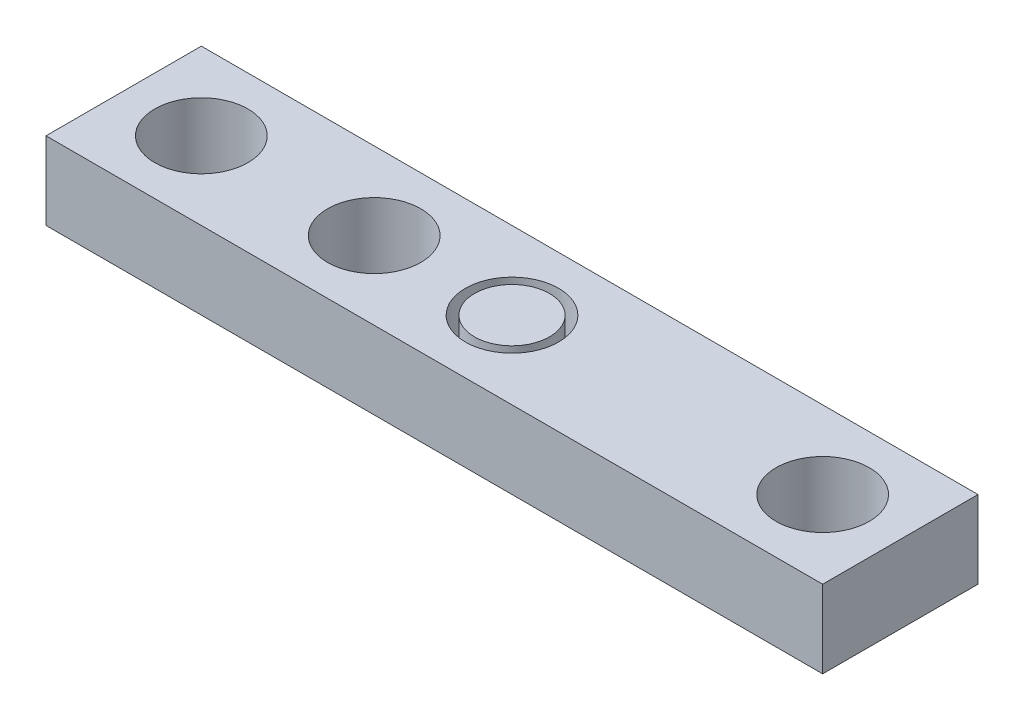
ISO-10303-21;
HEADER;
FILE_DESCRIPTION(('STEP AP214'),'2;1');
FILE_NAME('part.step','',(''),(''),'','','');
FILE_SCHEMA(('AUTOMOTIVE_DESIGN { 1 0 10303 214 1 1 1 1 }'));
ENDSEC;
DATA;
#1=APPLICATION_CONTEXT('core data for automotive mechanical design processes');
#2=APPLICATION_PROTOCOL_DEFINITION('international standard','automotive_design',2000,#1);
#3=PRODUCT_CONTEXT('',#1,'mechanical');
#4=PRODUCT('Part','Part','',(#3));
#5=PRODUCT_RELATED_PRODUCT_CATEGORY('part','',(#4));
#6=PRODUCT_DEFINITION_FORMATION('','',#4);
#7=PRODUCT_DEFINITION_CONTEXT('part definition',#1,'design');
#8=PRODUCT_DEFINITION('design','',#6,#7);
#9=PRODUCT_DEFINITION_SHAPE('','',#8);
#10=(LENGTH_UNIT() NAMED_UNIT(*) SI_UNIT(.MILLI.,.METRE.));
#11=(NAMED_UNIT(*) PLANE_ANGLE_UNIT() SI_UNIT($,.RADIAN.));
#12=(NAMED_UNIT(*) SI_UNIT($,.STERADIAN.) SOLID_ANGLE_UNIT());
#13=UNCERTAINTY_MEASURE_WITH_UNIT(LENGTH_MEASURE(1.E-05),#10,'distance_accuracy_value','');
#14=(GEOMETRIC_REPRESENTATION_CONTEXT(3) GLOBAL_UNCERTAINTY_ASSIGNED_CONTEXT((#13)) GLOBAL_UNIT_ASSIGNED_CONTEXT((#10,
#11,#12)) REPRESENTATION_CONTEXT('',''));
#15=CARTESIAN_POINT('',(0.,0.,0.));
#16=DIRECTION('',(0.,0.,1.));
#17=DIRECTION('',(1.,0.,0.));
#18=AXIS2_PLACEMENT_3D('',#15,#16,#17);
#19=CARTESIAN_POINT('',(0.,-2.5,0.));
#20=DIRECTION('',(0.,1.,0.));
#21=DIRECTION('',(0.,0.,1.));
#22=AXIS2_PLACEMENT_3D('',#19,#20,#21);
#23=CYLINDRICAL_SURFACE('',#22,2.41763312334941);
#24=CARTESIAN_POINT('',(0.,-2.5,0.));
#25=DIRECTION('',(0.,1.,0.));
#26=DIRECTION('',(0.,0.,1.));
#27=AXIS2_PLACEMENT_3D('',#24,#25,#26);
#28=CIRCLE('',#27,2.41763312334941);
#29=CARTESIAN_POINT('',(0.,-2.5,2.41763312334941));
#30=VERTEX_POINT('',#29);
#31=EDGE_CURVE('E11',#30,#30,#28,.T.);
#32=ORIENTED_EDGE('',*,*,#31,.T.);
#33=EDGE_LOOP('',(#32));
#34=FACE_BOUND('',#33,.T.);
#35=CARTESIAN_POINT('',(0.,2.5,0.));
#36=DIRECTION('',(0.,1.,0.));
#37=DIRECTION('',(0.,0.,1.));
#38=AXIS2_PLACEMENT_3D('',#35,#36,#37);
#39=CIRCLE('',#38,2.41763312334941);
#40=CARTESIAN_POINT('',(0.,2.5,2.41763312334941));
#41=VERTEX_POINT('',#40);
#42=EDGE_CURVE('E44',#41,#41,#39,.T.);
#43=ORIENTED_EDGE('',*,*,#42,.F.);
#44=EDGE_LOOP('',(#43));
#45=FACE_BOUND('',#44,.T.);
#46=ADVANCED_FACE('F41',(#34,#45),#23,.T.);
#47=CARTESIAN_POINT('',(0.,-2.5,0.));
#48=DIRECTION('',(0.,1.,0.));
#49=DIRECTION('',(0.,0.,1.));
#50=AXIS2_PLACEMENT_3D('',#47,#48,#49);
#51=PLANE('',#50);
#52=ORIENTED_EDGE('',*,*,#31,.F.);
#53=EDGE_LOOP('',(#52));
#54=FACE_BOUND('',#53,.T.);
#55=ADVANCED_FACE('F56',(#54),#51,.F.);
#56=CARTESIAN_POINT('',(0.,2.5,0.));
#57=DIRECTION('',(0.,1.,0.));
#58=DIRECTION('',(0.,0.,1.));
#59=AXIS2_PLACEMENT_3D('',#56,#57,#58);
#60=PLANE('',#59);
#61=ORIENTED_EDGE('',*,*,#42,.T.);
#62=EDGE_LOOP('',(#61));
#63=FACE_BOUND('',#62,.T.);
#64=ADVANCED_FACE('F53',(#63),#60,.T.);
#65=CLOSED_SHELL('',(#46,#55,#64));
#66=MANIFOLD_SOLID_BREP('B2',#65);
#67=CARTESIAN_POINT('',(0.,2.5,0.));
#68=DIRECTION('',(0.,-1.,0.));
#69=DIRECTION('',(0.,0.,-1.));
#70=AXIS2_PLACEMENT_3D('',#67,#68,#69);
#71=PLANE('',#70);
#72=CARTESIAN_POINT('',(-8.87122983832296,2.5,0.));
#73=DIRECTION('',(0.,1.,0.));
#74=DIRECTION('',(0.,0.,1.));
#75=AXIS2_PLACEMENT_3D('',#72,#73,#74);
#76=CIRCLE('',#75,3.);
#77=CARTESIAN_POINT('',(-8.87122983832296,2.5,3.));
#78=VERTEX_POINT('',#77);
#79=EDGE_CURVE('E178',#78,#78,#76,.T.);
#80=ORIENTED_EDGE('',*,*,#79,.F.);
#81=EDGE_LOOP('',(#80));
#82=FACE_BOUND('',#81,.T.);
#83=CARTESIAN_POINT('',(0.,2.5,0.));
#84=DIRECTION('',(0.,1.,0.));
#85=DIRECTION('',(0.,0.,1.));
#86=AXIS2_PLACEMENT_3D('',#83,#84,#85);
#87=CIRCLE('',#86,3.);
#88=CARTESIAN_POINT('',(0.,2.5,3.));
#89=VERTEX_POINT('',#88);
#90=EDGE_CURVE('E172',#89,#89,#87,.T.);
#91=ORIENTED_EDGE('',*,*,#90,.F.);
#92=EDGE_LOOP('',(#91));
#93=FACE_BOUND('',#92,.T.);
#94=DIRECTION('',(0.,0.,1.));
#95=VECTOR('',#94,1.);
#96=CARTESIAN_POINT('',(-25.,2.5,-5.));
#97=LINE('',#96,#95);
#98=CARTESIAN_POINT('',(-25.,2.5,-5.));
#99=VERTEX_POINT('',#98);
#100=CARTESIAN_POINT('',(-25.,2.5,5.));
#101=VERTEX_POINT('',#100);
#102=EDGE_CURVE('E133',#99,#101,#97,.T.);
#103=ORIENTED_EDGE('',*,*,#102,.T.);
#104=DIRECTION('',(1.,0.,0.));
#105=VECTOR('',#104,1.);
#106=CARTESIAN_POINT('',(25.,2.5,5.));
#107=LINE('',#106,#105);
#108=CARTESIAN_POINT('',(25.,2.5,5.));
#109=VERTEX_POINT('',#108);
#110=EDGE_CURVE('E128',#101,#109,#107,.T.);
#111=ORIENTED_EDGE('',*,*,#110,.T.);
#112=DIRECTION('',(0.,0.,-1.));
#113=VECTOR('',#112,1.);
#114=CARTESIAN_POINT('',(25.,2.5,-5.));
#115=LINE('',#114,#113);
#116=CARTESIAN_POINT('',(25.,2.5,-5.));
#117=VERTEX_POINT('',#116);
#118=EDGE_CURVE('E131',#109,#117,#115,.T.);
#119=ORIENTED_EDGE('',*,*,#118,.T.);
#120=DIRECTION('',(-1.,0.,0.));
#121=VECTOR('',#120,1.);
#122=CARTESIAN_POINT('',(25.,2.5,-5.));
#123=LINE('',#122,#121);
#124=EDGE_CURVE('E98',#117,#99,#123,.T.);
#125=ORIENTED_EDGE('',*,*,#124,.T.);
#126=EDGE_LOOP('',(#103,#111,#119,#125));
#127=FACE_BOUND('',#126,.T.);
#128=CARTESIAN_POINT('',(-20.,2.5,0.));
#129=DIRECTION('',(0.,1.,0.));
#130=DIRECTION('',(0.,0.,1.));
#131=AXIS2_PLACEMENT_3D('',#128,#129,#130);
#132=CIRCLE('',#131,2.99999999999999);
#133=CARTESIAN_POINT('',(-20.,2.5,2.99999999999999));
#134=VERTEX_POINT('',#133);
#135=EDGE_CURVE('E148',#134,#134,#132,.T.);
#136=ORIENTED_EDGE('',*,*,#135,.F.);
#137=EDGE_LOOP('',(#136));
#138=FACE_BOUND('',#137,.T.);
#139=CARTESIAN_POINT('',(20.,2.5,0.));
#140=DIRECTION('',(0.,1.,0.));
#141=DIRECTION('',(0.,0.,1.));
#142=AXIS2_PLACEMENT_3D('',#139,#140,#141);
#143=CIRCLE('',#142,2.99999999999999);
#144=CARTESIAN_POINT('',(20.,2.5,2.99999999999998));
#145=VERTEX_POINT('',#144);
#146=EDGE_CURVE('E163',#145,#145,#143,.T.);
#147=ORIENTED_EDGE('',*,*,#146,.F.);
#148=EDGE_LOOP('',(#147));
#149=FACE_BOUND('',#148,.T.);
#150=ADVANCED_FACE('F81',(#82,#93,#127,#138,#149),#71,.F.);
#151=CARTESIAN_POINT('',(0.,-2.5,0.));
#152=DIRECTION('',(0.,-1.,0.));
#153=DIRECTION('',(0.,0.,-1.));
#154=AXIS2_PLACEMENT_3D('',#151,#152,#153);
#155=PLANE('',#154);
#156=CARTESIAN_POINT('',(-8.87122983832296,-2.5,0.));
#157=DIRECTION('',(0.,1.,0.));
#158=DIRECTION('',(0.,0.,1.));
#159=AXIS2_PLACEMENT_3D('',#156,#157,#158);
#160=CIRCLE('',#159,3.);
#161=CARTESIAN_POINT('',(-8.87122983832296,-2.5,3.));
#162=VERTEX_POINT('',#161);
#163=EDGE_CURVE('E175',#162,#162,#160,.T.);
#164=ORIENTED_EDGE('',*,*,#163,.T.);
#165=EDGE_LOOP('',(#164));
#166=FACE_BOUND('',#165,.T.);
#167=CARTESIAN_POINT('',(0.,-2.5,0.));
#168=DIRECTION('',(0.,1.,0.));
#169=DIRECTION('',(0.,0.,1.));
#170=AXIS2_PLACEMENT_3D('',#167,#168,#169);
#171=CIRCLE('',#170,3.);
#172=CARTESIAN_POINT('',(0.,-2.5,3.));
#173=VERTEX_POINT('',#172);
#174=EDGE_CURVE('E169',#173,#173,#171,.T.);
#175=ORIENTED_EDGE('',*,*,#174,.T.);
#176=EDGE_LOOP('',(#175));
#177=FACE_BOUND('',#176,.T.);
#178=CARTESIAN_POINT('',(-20.,-2.5,0.));
#179=DIRECTION('',(0.,1.,0.));
#180=DIRECTION('',(0.,0.,1.));
#181=AXIS2_PLACEMENT_3D('',#178,#179,#180);
#182=CIRCLE('',#181,2.99999999999999);
#183=CARTESIAN_POINT('',(-20.,-2.5,2.99999999999999));
#184=VERTEX_POINT('',#183);
#185=EDGE_CURVE('E160',#184,#184,#182,.T.);
#186=ORIENTED_EDGE('',*,*,#185,.T.);
#187=EDGE_LOOP('',(#186));
#188=FACE_BOUND('',#187,.T.);
#189=DIRECTION('',(0.,0.,1.));
#190=VECTOR('',#189,1.);
#191=CARTESIAN_POINT('',(-25.,-2.5,-5.));
#192=LINE('',#191,#190);
#193=CARTESIAN_POINT('',(-25.,-2.5,-5.));
#194=VERTEX_POINT('',#193);
#195=CARTESIAN_POINT('',(-25.,-2.5,5.));
#196=VERTEX_POINT('',#195);
#197=EDGE_CURVE('E145',#194,#196,#192,.T.);
#198=ORIENTED_EDGE('',*,*,#197,.F.);
#199=DIRECTION('',(-1.,0.,0.));
#200=VECTOR('',#199,1.);
#201=CARTESIAN_POINT('',(25.,-2.5,-5.));
#202=LINE('',#201,#200);
#203=CARTESIAN_POINT('',(25.,-2.5,-5.));
#204=VERTEX_POINT('',#203);
#205=EDGE_CURVE('E121',#204,#194,#202,.T.);
#206=ORIENTED_EDGE('',*,*,#205,.F.);
#207=DIRECTION('',(0.,0.,-1.));
#208=VECTOR('',#207,1.);
#209=CARTESIAN_POINT('',(25.,-2.5,-5.));
#210=LINE('',#209,#208);
#211=CARTESIAN_POINT('',(25.,-2.5,5.));
#212=VERTEX_POINT('',#211);
#213=EDGE_CURVE('E115',#212,#204,#210,.T.);
#214=ORIENTED_EDGE('',*,*,#213,.F.);
#215=DIRECTION('',(1.,0.,0.));
#216=VECTOR('',#215,1.);
#217=CARTESIAN_POINT('',(25.,-2.5,5.));
#218=LINE('',#217,#216);
#219=EDGE_CURVE('E137',#196,#212,#218,.T.);
#220=ORIENTED_EDGE('',*,*,#219,.F.);
#221=EDGE_LOOP('',(#198,#206,#214,#220));
#222=FACE_BOUND('',#221,.T.);
#223=CARTESIAN_POINT('',(20.,-2.5,0.));
#224=DIRECTION('',(0.,1.,0.));
#225=DIRECTION('',(0.,0.,1.));
#226=AXIS2_PLACEMENT_3D('',#223,#224,#225);
#227=CIRCLE('',#226,2.99999999999999);
#228=CARTESIAN_POINT('',(20.,-2.5,2.99999999999998));
#229=VERTEX_POINT('',#228);
#230=EDGE_CURVE('E166',#229,#229,#227,.T.);
#231=ORIENTED_EDGE('',*,*,#230,.T.);
#232=EDGE_LOOP('',(#231));
#233=FACE_BOUND('',#232,.T.);
#234=ADVANCED_FACE('F156',(#166,#177,#188,#222,#233),#155,.T.);
#235=CARTESIAN_POINT('',(-25.,2.5,-5.));
#236=DIRECTION('',(1.,0.,0.));
#237=DIRECTION('',(0.,0.,-1.));
#238=AXIS2_PLACEMENT_3D('',#235,#236,#237);
#239=PLANE('',#238);
#240=ORIENTED_EDGE('',*,*,#197,.T.);
#241=DIRECTION('',(0.,-1.,0.));
#242=VECTOR('',#241,1.);
#243=CARTESIAN_POINT('',(-25.,2.5,5.));
#244=LINE('',#243,#242);
#245=EDGE_CURVE('E39',#101,#196,#244,.T.);
#246=ORIENTED_EDGE('',*,*,#245,.F.);
#247=ORIENTED_EDGE('',*,*,#102,.F.);
#248=DIRECTION('',(0.,-1.,0.));
#249=VECTOR('',#248,1.);
#250=CARTESIAN_POINT('',(-25.,2.5,-5.));
#251=LINE('',#250,#249);
#252=EDGE_CURVE('E141',#99,#194,#251,.T.);
#253=ORIENTED_EDGE('',*,*,#252,.T.);
#254=EDGE_LOOP('',(#240,#246,#247,#253));
#255=FACE_BOUND('',#254,.T.);
#256=ADVANCED_FACE('F83',(#255),#239,.F.);
#257=CARTESIAN_POINT('',(25.,2.5,5.));
#258=DIRECTION('',(0.,0.,-1.));
#259=DIRECTION('',(-1.,0.,0.));
#260=AXIS2_PLACEMENT_3D('',#257,#258,#259);
#261=PLANE('',#260);
#262=ORIENTED_EDGE('',*,*,#219,.T.);
#263=DIRECTION('',(0.,-1.,0.));
#264=VECTOR('',#263,1.);
#265=CARTESIAN_POINT('',(25.,2.5,5.));
#266=LINE('',#265,#264);
#267=EDGE_CURVE('E90',#109,#212,#266,.T.);
#268=ORIENTED_EDGE('',*,*,#267,.F.);
#269=ORIENTED_EDGE('',*,*,#110,.F.);
#270=ORIENTED_EDGE('',*,*,#245,.T.);
#271=EDGE_LOOP('',(#262,#268,#269,#270));
#272=FACE_BOUND('',#271,.T.);
#273=ADVANCED_FACE('F136',(#272),#261,.F.);
#274=CARTESIAN_POINT('',(25.,2.5,-5.));
#275=DIRECTION('',(-1.,0.,0.));
#276=DIRECTION('',(0.,0.,1.));
#277=AXIS2_PLACEMENT_3D('',#274,#275,#276);
#278=PLANE('',#277);
#279=ORIENTED_EDGE('',*,*,#213,.T.);
#280=DIRECTION('',(0.,-1.,0.));
#281=VECTOR('',#280,1.);
#282=CARTESIAN_POINT('',(25.,2.5,-5.));
#283=LINE('',#282,#281);
#284=EDGE_CURVE('E138',#117,#204,#283,.T.);
#285=ORIENTED_EDGE('',*,*,#284,.F.);
#286=ORIENTED_EDGE('',*,*,#118,.F.);
#287=ORIENTED_EDGE('',*,*,#267,.T.);
#288=EDGE_LOOP('',(#279,#285,#286,#287));
#289=FACE_BOUND('',#288,.T.);
#290=ADVANCED_FACE('F139',(#289),#278,.F.);
#291=CARTESIAN_POINT('',(25.,2.5,-5.));
#292=DIRECTION('',(0.,0.,1.));
#293=DIRECTION('',(1.,0.,0.));
#294=AXIS2_PLACEMENT_3D('',#291,#292,#293);
#295=PLANE('',#294);
#296=ORIENTED_EDGE('',*,*,#205,.T.);
#297=ORIENTED_EDGE('',*,*,#252,.F.);
#298=ORIENTED_EDGE('',*,*,#124,.F.);
#299=ORIENTED_EDGE('',*,*,#284,.T.);
#300=EDGE_LOOP('',(#296,#297,#298,#299));
#301=FACE_BOUND('',#300,.T.);
#302=ADVANCED_FACE('F153',(#301),#295,.F.);
#303=CARTESIAN_POINT('',(-20.,2.5,0.));
#304=DIRECTION('',(0.,-1.,0.));
#305=DIRECTION('',(0.,0.,-1.));
#306=AXIS2_PLACEMENT_3D('',#303,#304,#305);
#307=CYLINDRICAL_SURFACE('',#306,2.99999999999999);
#308=ORIENTED_EDGE('',*,*,#135,.T.);
#309=EDGE_LOOP('',(#308));
#310=FACE_BOUND('',#309,.T.);
#311=ORIENTED_EDGE('',*,*,#185,.F.);
#312=EDGE_LOOP('',(#311));
#313=FACE_BOUND('',#312,.T.);
#314=ADVANCED_FACE('F205',(#310,#313),#307,.F.);
#315=CARTESIAN_POINT('',(20.,2.5,0.));
#316=DIRECTION('',(0.,-1.,0.));
#317=DIRECTION('',(0.,0.,-1.));
#318=AXIS2_PLACEMENT_3D('',#315,#316,#317);
#319=CYLINDRICAL_SURFACE('',#318,2.99999999999999);
#320=ORIENTED_EDGE('',*,*,#146,.T.);
#321=EDGE_LOOP('',(#320));
#322=FACE_BOUND('',#321,.T.);
#323=ORIENTED_EDGE('',*,*,#230,.F.);
#324=EDGE_LOOP('',(#323));
#325=FACE_BOUND('',#324,.T.);
#326=ADVANCED_FACE('F199',(#322,#325),#319,.F.);
#327=CARTESIAN_POINT('',(0.,-2.5,0.));
#328=DIRECTION('',(0.,1.,0.));
#329=DIRECTION('',(0.,0.,1.));
#330=AXIS2_PLACEMENT_3D('',#327,#328,#329);
#331=CYLINDRICAL_SURFACE('',#330,3.);
#332=ORIENTED_EDGE('',*,*,#174,.F.);
#333=EDGE_LOOP('',(#332));
#334=FACE_BOUND('',#333,.T.);
#335=ORIENTED_EDGE('',*,*,#90,.T.);
#336=EDGE_LOOP('',(#335));
#337=FACE_BOUND('',#336,.T.);
#338=ADVANCED_FACE('F189',(#334,#337),#331,.F.);
#339=CARTESIAN_POINT('',(-8.87122983832296,-2.5,0.));
#340=DIRECTION('',(0.,1.,0.));
#341=DIRECTION('',(0.,0.,1.));
#342=AXIS2_PLACEMENT_3D('',#339,#340,#341);
#343=CYLINDRICAL_SURFACE('',#342,3.);
#344=ORIENTED_EDGE('',*,*,#163,.F.);
#345=EDGE_LOOP('',(#344));
#346=FACE_BOUND('',#345,.T.);
#347=ORIENTED_EDGE('',*,*,#79,.T.);
#348=EDGE_LOOP('',(#347));
#349=FACE_BOUND('',#348,.T.);
#350=ADVANCED_FACE('F186',(#346,#349),#343,.F.);
#351=CLOSED_SHELL('',(#150,#234,#256,#273,#290,#302,#314,#326,#338,#350));
#352=MANIFOLD_SOLID_BREP('B6',#351);
#353=ADVANCED_BREP_SHAPE_REPRESENTATION('',(#18,#66,#352),#14);
#354=SHAPE_DEFINITION_REPRESENTATION(#9,#353);
ENDSEC;
END-ISO-10303-21;
